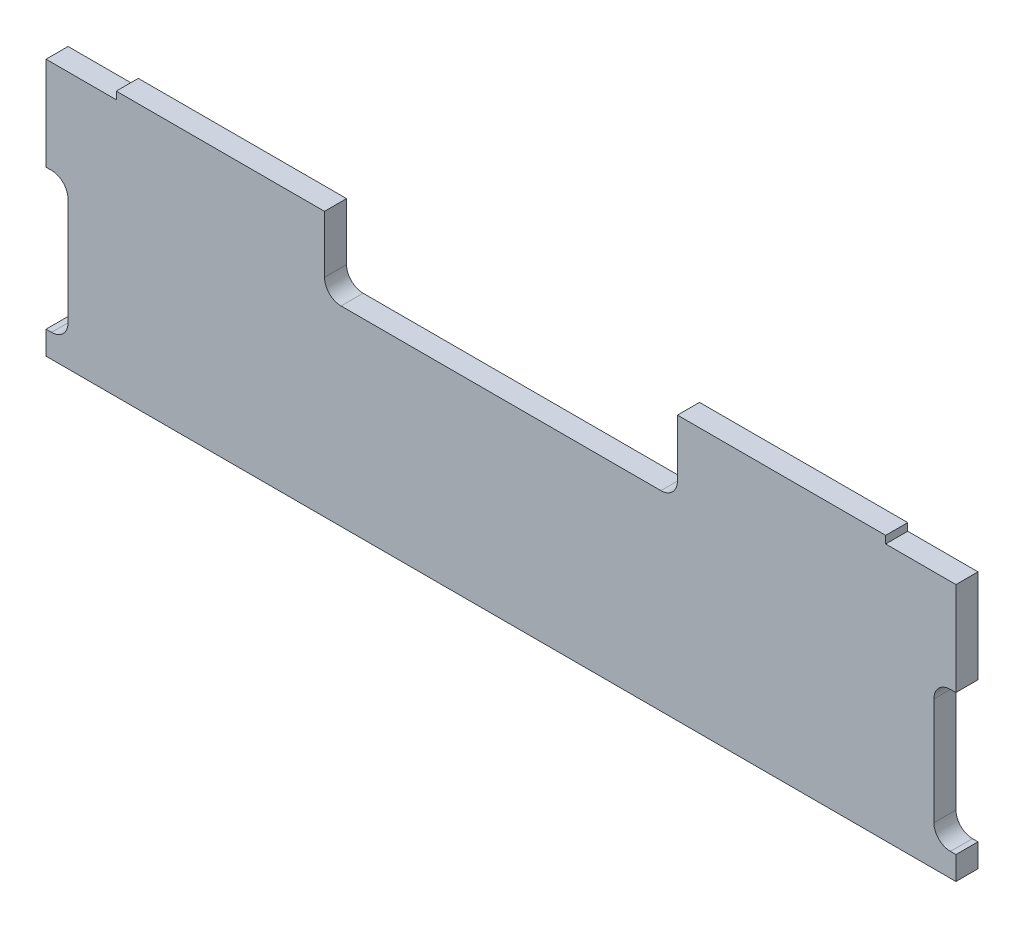
ISO-10303-21;
HEADER;
FILE_DESCRIPTION(('STEP AP214'),'2;1');
FILE_NAME('part.step','',(''),(''),'','','');
FILE_SCHEMA(('AUTOMOTIVE_DESIGN { 1 0 10303 214 1 1 1 1 }'));
ENDSEC;
DATA;
#1=APPLICATION_CONTEXT('core data for automotive mechanical design processes');
#2=APPLICATION_PROTOCOL_DEFINITION('international standard','automotive_design',2000,#1);
#3=PRODUCT_CONTEXT('',#1,'mechanical');
#4=PRODUCT('Part','Part','',(#3));
#5=PRODUCT_RELATED_PRODUCT_CATEGORY('part','',(#4));
#6=PRODUCT_DEFINITION_FORMATION('','',#4);
#7=PRODUCT_DEFINITION_CONTEXT('part definition',#1,'design');
#8=PRODUCT_DEFINITION('design','',#6,#7);
#9=PRODUCT_DEFINITION_SHAPE('','',#8);
#10=(LENGTH_UNIT() NAMED_UNIT(*) SI_UNIT(.MILLI.,.METRE.));
#11=(NAMED_UNIT(*) PLANE_ANGLE_UNIT() SI_UNIT($,.RADIAN.));
#12=(NAMED_UNIT(*) SI_UNIT($,.STERADIAN.) SOLID_ANGLE_UNIT());
#13=UNCERTAINTY_MEASURE_WITH_UNIT(LENGTH_MEASURE(1.E-05),#10,'distance_accuracy_value','');
#14=(GEOMETRIC_REPRESENTATION_CONTEXT(3) GLOBAL_UNCERTAINTY_ASSIGNED_CONTEXT((#13)) GLOBAL_UNIT_ASSIGNED_CONTEXT((#10,
#11,#12)) REPRESENTATION_CONTEXT('',''));
#15=CARTESIAN_POINT('',(0.,0.,0.));
#16=DIRECTION('',(0.,0.,1.));
#17=DIRECTION('',(1.,0.,0.));
#18=AXIS2_PLACEMENT_3D('',#15,#16,#17);
#19=CARTESIAN_POINT('',(130.96875,37.0049753820034,6.35));
#20=DIRECTION('',(0.,-1.,0.));
#21=DIRECTION('',(1.,0.,0.));
#22=AXIS2_PLACEMENT_3D('',#19,#20,#21);
#23=PLANE('',#22);
#24=DIRECTION('',(-1.,0.,0.));
#25=VECTOR('',#24,1.);
#26=CARTESIAN_POINT('',(130.96875,37.0049753820034,6.35));
#27=LINE('',#26,#25);
#28=CARTESIAN_POINT('',(-110.744,37.0049753820034,6.35));
#29=VERTEX_POINT('',#28);
#30=CARTESIAN_POINT('',(-130.96875,37.0049753820034,6.35));
#31=VERTEX_POINT('',#30);
#32=EDGE_CURVE('E282',#29,#31,#27,.T.);
#33=ORIENTED_EDGE('',*,*,#32,.F.);
#34=DIRECTION('',(0.,0.,1.));
#35=VECTOR('',#34,1.);
#36=CARTESIAN_POINT('',(-110.744,37.0049753820034,-59.9828676957012));
#37=LINE('',#36,#35);
#38=CARTESIAN_POINT('',(-110.744,37.0049753820034,0.));
#39=VERTEX_POINT('',#38);
#40=EDGE_CURVE('E245',#39,#29,#37,.T.);
#41=ORIENTED_EDGE('',*,*,#40,.F.);
#42=DIRECTION('',(-1.,0.,0.));
#43=VECTOR('',#42,1.);
#44=CARTESIAN_POINT('',(130.96875,37.0049753820034,0.));
#45=LINE('',#44,#43);
#46=CARTESIAN_POINT('',(-130.96875,37.0049753820034,0.));
#47=VERTEX_POINT('',#46);
#48=EDGE_CURVE('E272',#39,#47,#45,.T.);
#49=ORIENTED_EDGE('',*,*,#48,.T.);
#50=DIRECTION('',(0.,0.,-1.));
#51=VECTOR('',#50,1.);
#52=CARTESIAN_POINT('',(-130.96875,37.0049753820034,6.35));
#53=LINE('',#52,#51);
#54=EDGE_CURVE('E317',#31,#47,#53,.T.);
#55=ORIENTED_EDGE('',*,*,#54,.F.);
#56=EDGE_LOOP('',(#33,#41,#49,#55));
#57=FACE_BOUND('',#56,.T.);
#58=ADVANCED_FACE('F34',(#57),#23,.F.);
#59=CARTESIAN_POINT('',(130.96875,37.0049753820034,6.35));
#60=DIRECTION('',(-1.,0.,0.));
#61=DIRECTION('',(0.,0.,1.));
#62=AXIS2_PLACEMENT_3D('',#59,#60,#61);
#63=PLANE('',#62);
#64=DIRECTION('',(0.,1.,0.));
#65=VECTOR('',#64,1.);
#66=CARTESIAN_POINT('',(130.96875,37.0049753820034,0.));
#67=LINE('',#66,#65);
#68=CARTESIAN_POINT('',(130.96875,-37.0360246179966,0.));
#69=VERTEX_POINT('',#68);
#70=CARTESIAN_POINT('',(130.96875,-30.3050246179966,0.));
#71=VERTEX_POINT('',#70);
#72=EDGE_CURVE('E269',#69,#71,#67,.T.);
#73=ORIENTED_EDGE('',*,*,#72,.T.);
#74=DIRECTION('',(0.,0.,1.));
#75=VECTOR('',#74,1.);
#76=CARTESIAN_POINT('',(130.96875,-30.3050246179966,0.));
#77=LINE('',#76,#75);
#78=CARTESIAN_POINT('',(130.96875,-30.3050246179966,6.35));
#79=VERTEX_POINT('',#78);
#80=EDGE_CURVE('E274',#71,#79,#77,.T.);
#81=ORIENTED_EDGE('',*,*,#80,.T.);
#82=DIRECTION('',(0.,1.,0.));
#83=VECTOR('',#82,1.);
#84=CARTESIAN_POINT('',(130.96875,37.0049753820034,6.35));
#85=LINE('',#84,#83);
#86=CARTESIAN_POINT('',(130.96875,-37.0360246179966,6.35));
#87=VERTEX_POINT('',#86);
#88=EDGE_CURVE('E279',#87,#79,#85,.T.);
#89=ORIENTED_EDGE('',*,*,#88,.F.);
#90=DIRECTION('',(0.,0.,-1.));
#91=VECTOR('',#90,1.);
#92=CARTESIAN_POINT('',(130.96875,-37.0360246179966,6.35));
#93=LINE('',#92,#91);
#94=EDGE_CURVE('E284',#87,#69,#93,.T.);
#95=ORIENTED_EDGE('',*,*,#94,.T.);
#96=EDGE_LOOP('',(#73,#81,#89,#95));
#97=FACE_BOUND('',#96,.T.);
#98=ADVANCED_FACE('F455',(#97),#63,.F.);
#99=CARTESIAN_POINT('',(-130.96875,37.0049753820034,6.35));
#100=DIRECTION('',(1.,0.,0.));
#101=DIRECTION('',(0.,0.,-1.));
#102=AXIS2_PLACEMENT_3D('',#99,#100,#101);
#103=PLANE('',#102);
#104=DIRECTION('',(0.,-1.,0.));
#105=VECTOR('',#104,1.);
#106=CARTESIAN_POINT('',(-130.96875,37.0049753820034,0.));
#107=LINE('',#106,#105);
#108=CARTESIAN_POINT('',(-130.96875,10.0809753820034,0.));
#109=VERTEX_POINT('',#108);
#110=EDGE_CURVE('E291',#47,#109,#107,.T.);
#111=ORIENTED_EDGE('',*,*,#110,.T.);
#112=DIRECTION('',(0.,0.,1.));
#113=VECTOR('',#112,1.);
#114=CARTESIAN_POINT('',(-130.96875,10.0809753820034,0.));
#115=LINE('',#114,#113);
#116=CARTESIAN_POINT('',(-130.96875,10.0809753820034,6.35));
#117=VERTEX_POINT('',#116);
#118=EDGE_CURVE('E302',#109,#117,#115,.T.);
#119=ORIENTED_EDGE('',*,*,#118,.T.);
#120=DIRECTION('',(0.,-1.,0.));
#121=VECTOR('',#120,1.);
#122=CARTESIAN_POINT('',(-130.96875,37.0049753820034,6.35));
#123=LINE('',#122,#121);
#124=EDGE_CURVE('E294',#31,#117,#123,.T.);
#125=ORIENTED_EDGE('',*,*,#124,.F.);
#126=ORIENTED_EDGE('',*,*,#54,.T.);
#127=EDGE_LOOP('',(#111,#119,#125,#126));
#128=FACE_BOUND('',#127,.T.);
#129=ADVANCED_FACE('F492',(#128),#103,.F.);
#130=DIRECTION('',(0.,-1.,0.));
#131=VECTOR('',#130,1.);
#132=CARTESIAN_POINT('',(-130.96875,37.0049753820034,6.35));
#133=LINE('',#132,#131);
#134=CARTESIAN_POINT('',(-130.96875,-30.3050246179966,6.35));
#135=VERTEX_POINT('',#134);
#136=CARTESIAN_POINT('',(-130.96875,-37.0360246179966,6.35));
#137=VERTEX_POINT('',#136);
#138=EDGE_CURVE('E298',#135,#137,#133,.T.);
#139=ORIENTED_EDGE('',*,*,#138,.F.);
#140=DIRECTION('',(0.,0.,1.));
#141=VECTOR('',#140,1.);
#142=CARTESIAN_POINT('',(-130.96875,-30.3050246179966,0.));
#143=LINE('',#142,#141);
#144=CARTESIAN_POINT('',(-130.96875,-30.3050246179966,0.));
#145=VERTEX_POINT('',#144);
#146=EDGE_CURVE('E300',#145,#135,#143,.T.);
#147=ORIENTED_EDGE('',*,*,#146,.F.);
#148=DIRECTION('',(0.,-1.,0.));
#149=VECTOR('',#148,1.);
#150=CARTESIAN_POINT('',(-130.96875,37.0049753820034,0.));
#151=LINE('',#150,#149);
#152=CARTESIAN_POINT('',(-130.96875,-37.0360246179966,0.));
#153=VERTEX_POINT('',#152);
#154=EDGE_CURVE('E304',#145,#153,#151,.T.);
#155=ORIENTED_EDGE('',*,*,#154,.T.);
#156=DIRECTION('',(0.,0.,-1.));
#157=VECTOR('',#156,1.);
#158=CARTESIAN_POINT('',(-130.96875,-37.0360246179966,6.35));
#159=LINE('',#158,#157);
#160=EDGE_CURVE('E287',#137,#153,#159,.T.);
#161=ORIENTED_EDGE('',*,*,#160,.F.);
#162=EDGE_LOOP('',(#139,#147,#155,#161));
#163=FACE_BOUND('',#162,.T.);
#164=ADVANCED_FACE('F464',(#163),#103,.F.);
#165=CARTESIAN_POINT('',(130.96875,-37.0360246179966,6.35));
#166=DIRECTION('',(0.,1.,0.));
#167=DIRECTION('',(-1.,0.,0.));
#168=AXIS2_PLACEMENT_3D('',#165,#166,#167);
#169=PLANE('',#168);
#170=DIRECTION('',(1.,0.,0.));
#171=VECTOR('',#170,1.);
#172=CARTESIAN_POINT('',(130.96875,-37.0360246179966,0.));
#173=LINE('',#172,#171);
#174=EDGE_CURVE('E289',#153,#69,#173,.T.);
#175=ORIENTED_EDGE('',*,*,#174,.T.);
#176=ORIENTED_EDGE('',*,*,#94,.F.);
#177=DIRECTION('',(1.,0.,0.));
#178=VECTOR('',#177,1.);
#179=CARTESIAN_POINT('',(130.96875,-37.0360246179966,6.35));
#180=LINE('',#179,#178);
#181=EDGE_CURVE('E292',#137,#87,#180,.T.);
#182=ORIENTED_EDGE('',*,*,#181,.F.);
#183=ORIENTED_EDGE('',*,*,#160,.T.);
#184=EDGE_LOOP('',(#175,#176,#182,#183));
#185=FACE_BOUND('',#184,.T.);
#186=ADVANCED_FACE('F461',(#185),#169,.F.);
#187=DIRECTION('',(0.,1.,0.));
#188=VECTOR('',#187,1.);
#189=CARTESIAN_POINT('',(130.96875,37.0049753820034,6.35));
#190=LINE('',#189,#188);
#191=CARTESIAN_POINT('',(130.96875,10.0809753820034,6.35));
#192=VERTEX_POINT('',#191);
#193=CARTESIAN_POINT('',(130.96875,37.0049753820034,6.35));
#194=VERTEX_POINT('',#193);
#195=EDGE_CURVE('E283',#192,#194,#190,.T.);
#196=ORIENTED_EDGE('',*,*,#195,.F.);
#197=DIRECTION('',(0.,0.,1.));
#198=VECTOR('',#197,1.);
#199=CARTESIAN_POINT('',(130.96875,10.0809753820034,0.));
#200=LINE('',#199,#198);
#201=CARTESIAN_POINT('',(130.96875,10.0809753820034,0.));
#202=VERTEX_POINT('',#201);
#203=EDGE_CURVE('E278',#202,#192,#200,.T.);
#204=ORIENTED_EDGE('',*,*,#203,.F.);
#205=DIRECTION('',(0.,1.,0.));
#206=VECTOR('',#205,1.);
#207=CARTESIAN_POINT('',(130.96875,37.0049753820034,0.));
#208=LINE('',#207,#206);
#209=CARTESIAN_POINT('',(130.96875,37.0049753820034,0.));
#210=VERTEX_POINT('',#209);
#211=EDGE_CURVE('E273',#202,#210,#208,.T.);
#212=ORIENTED_EDGE('',*,*,#211,.T.);
#213=DIRECTION('',(0.,0.,-1.));
#214=VECTOR('',#213,1.);
#215=CARTESIAN_POINT('',(130.96875,37.0049753820034,6.35));
#216=LINE('',#215,#214);
#217=EDGE_CURVE('E288',#194,#210,#216,.T.);
#218=ORIENTED_EDGE('',*,*,#217,.F.);
#219=EDGE_LOOP('',(#196,#204,#212,#218));
#220=FACE_BOUND('',#219,.T.);
#221=ADVANCED_FACE('F430',(#220),#63,.F.);
#222=CARTESIAN_POINT('',(110.744,37.0049753820034,0.));
#223=VERTEX_POINT('',#222);
#224=EDGE_CURVE('E54',#210,#223,#45,.T.);
#225=ORIENTED_EDGE('',*,*,#224,.T.);
#226=DIRECTION('',(0.,0.,1.));
#227=VECTOR('',#226,1.);
#228=CARTESIAN_POINT('',(110.744,37.0049753820034,-59.9828676957012));
#229=LINE('',#228,#227);
#230=CARTESIAN_POINT('',(110.744,37.0049753820034,6.35));
#231=VERTEX_POINT('',#230);
#232=EDGE_CURVE('E49',#223,#231,#229,.T.);
#233=ORIENTED_EDGE('',*,*,#232,.T.);
#234=EDGE_CURVE('E315',#194,#231,#27,.T.);
#235=ORIENTED_EDGE('',*,*,#234,.F.);
#236=ORIENTED_EDGE('',*,*,#217,.T.);
#237=EDGE_LOOP('',(#225,#233,#235,#236));
#238=FACE_BOUND('',#237,.T.);
#239=ADVANCED_FACE('F425',(#238),#23,.F.);
#240=CARTESIAN_POINT('',(0.,-0.0155246179966039,6.35));
#241=DIRECTION('',(0.,0.,-1.));
#242=DIRECTION('',(-1.,0.,0.));
#243=AXIS2_PLACEMENT_3D('',#240,#241,#242);
#244=PLANE('',#243);
#245=DIRECTION('',(1.,0.,0.));
#246=VECTOR('',#245,1.);
#247=CARTESIAN_POINT('',(-50.8,17.9549753820034,6.35));
#248=LINE('',#247,#246);
#249=CARTESIAN_POINT('',(-46.0375,17.9549753820034,6.35));
#250=VERTEX_POINT('',#249);
#251=CARTESIAN_POINT('',(46.0375,17.9549753820034,6.35));
#252=VERTEX_POINT('',#251);
#253=EDGE_CURVE('E265',#250,#252,#248,.T.);
#254=ORIENTED_EDGE('',*,*,#253,.F.);
#255=CARTESIAN_POINT('',(-46.0375,22.7174753820034,6.35));
#256=DIRECTION('',(0.,0.,-1.));
#257=DIRECTION('',(-1.,0.,0.));
#258=AXIS2_PLACEMENT_3D('',#255,#256,#257);
#259=CIRCLE('',#258,4.7625);
#260=CARTESIAN_POINT('',(-50.8,22.7174753820034,6.35));
#261=VERTEX_POINT('',#260);
#262=EDGE_CURVE('E42',#250,#261,#259,.T.);
#263=ORIENTED_EDGE('',*,*,#262,.T.);
#264=DIRECTION('',(0.,-1.,0.));
#265=VECTOR('',#264,1.);
#266=CARTESIAN_POINT('',(-50.8,37.0049753820034,6.35));
#267=LINE('',#266,#265);
#268=CARTESIAN_POINT('',(-50.8,39.1639753820034,6.35));
#269=VERTEX_POINT('',#268);
#270=EDGE_CURVE('E254',#269,#261,#267,.T.);
#271=ORIENTED_EDGE('',*,*,#270,.F.);
#272=DIRECTION('',(-1.,0.,0.));
#273=VECTOR('',#272,1.);
#274=CARTESIAN_POINT('',(-110.744,39.1639753820034,6.35));
#275=LINE('',#274,#273);
#276=CARTESIAN_POINT('',(-110.744,39.1639753820034,6.35));
#277=VERTEX_POINT('',#276);
#278=EDGE_CURVE('E237',#269,#277,#275,.T.);
#279=ORIENTED_EDGE('',*,*,#278,.T.);
#280=DIRECTION('',(0.,-1.,0.));
#281=VECTOR('',#280,1.);
#282=CARTESIAN_POINT('',(-110.744,37.0049753820034,6.35));
#283=LINE('',#282,#281);
#284=EDGE_CURVE('E236',#277,#29,#283,.T.);
#285=ORIENTED_EDGE('',*,*,#284,.T.);
#286=ORIENTED_EDGE('',*,*,#32,.T.);
#287=ORIENTED_EDGE('',*,*,#124,.T.);
#288=DIRECTION('',(-1.,0.,0.));
#289=VECTOR('',#288,1.);
#290=CARTESIAN_POINT('',(-130.96875,10.0809753820034,6.35));
#291=LINE('',#290,#289);
#292=CARTESIAN_POINT('',(-129.38125,10.0809753820034,6.35));
#293=VERTEX_POINT('',#292);
#294=EDGE_CURVE('E320',#293,#117,#291,.T.);
#295=ORIENTED_EDGE('',*,*,#294,.F.);
#296=CARTESIAN_POINT('',(-129.38125,5.31847538200337,6.35));
#297=DIRECTION('',(0.,0.,-1.));
#298=DIRECTION('',(-1.,0.,0.));
#299=AXIS2_PLACEMENT_3D('',#296,#297,#298);
#300=CIRCLE('',#299,4.7625);
#301=CARTESIAN_POINT('',(-124.61875,5.31847538200337,6.35));
#302=VERTEX_POINT('',#301);
#303=EDGE_CURVE('E392',#293,#302,#300,.T.);
#304=ORIENTED_EDGE('',*,*,#303,.T.);
#305=DIRECTION('',(0.,1.,0.));
#306=VECTOR('',#305,1.);
#307=CARTESIAN_POINT('',(-124.61875,10.0809753820034,6.35));
#308=LINE('',#307,#306);
#309=CARTESIAN_POINT('',(-124.61875,-25.5425246179966,6.35));
#310=VERTEX_POINT('',#309);
#311=EDGE_CURVE('E323',#310,#302,#308,.T.);
#312=ORIENTED_EDGE('',*,*,#311,.F.);
#313=CARTESIAN_POINT('',(-129.38125,-25.5425246179966,6.35));
#314=DIRECTION('',(0.,0.,-1.));
#315=DIRECTION('',(-1.,0.,0.));
#316=AXIS2_PLACEMENT_3D('',#313,#314,#315);
#317=CIRCLE('',#316,4.7625);
#318=CARTESIAN_POINT('',(-129.38125,-30.3050246179966,6.35));
#319=VERTEX_POINT('',#318);
#320=EDGE_CURVE('E388',#310,#319,#317,.T.);
#321=ORIENTED_EDGE('',*,*,#320,.T.);
#322=DIRECTION('',(1.,0.,0.));
#323=VECTOR('',#322,1.);
#324=CARTESIAN_POINT('',(-130.96875,-30.3050246179966,6.35));
#325=LINE('',#324,#323);
#326=EDGE_CURVE('E277',#135,#319,#325,.T.);
#327=ORIENTED_EDGE('',*,*,#326,.F.);
#328=ORIENTED_EDGE('',*,*,#138,.T.);
#329=ORIENTED_EDGE('',*,*,#181,.T.);
#330=ORIENTED_EDGE('',*,*,#88,.T.);
#331=DIRECTION('',(1.,0.,0.));
#332=VECTOR('',#331,1.);
#333=CARTESIAN_POINT('',(130.96875,-30.3050246179966,6.35));
#334=LINE('',#333,#332);
#335=CARTESIAN_POINT('',(129.38125,-30.3050246179966,6.35));
#336=VERTEX_POINT('',#335);
#337=EDGE_CURVE('E306',#336,#79,#334,.T.);
#338=ORIENTED_EDGE('',*,*,#337,.F.);
#339=CARTESIAN_POINT('',(129.38125,-25.5425246179966,6.35));
#340=DIRECTION('',(0.,0.,-1.));
#341=DIRECTION('',(-1.,0.,0.));
#342=AXIS2_PLACEMENT_3D('',#339,#340,#341);
#343=CIRCLE('',#342,4.7625);
#344=CARTESIAN_POINT('',(124.61875,-25.5425246179966,6.35));
#345=VERTEX_POINT('',#344);
#346=EDGE_CURVE('E380',#336,#345,#343,.T.);
#347=ORIENTED_EDGE('',*,*,#346,.T.);
#348=DIRECTION('',(0.,-1.,0.));
#349=VECTOR('',#348,1.);
#350=CARTESIAN_POINT('',(124.61875,10.0809753820034,6.35));
#351=LINE('',#350,#349);
#352=CARTESIAN_POINT('',(124.61875,5.3184753820034,6.35));
#353=VERTEX_POINT('',#352);
#354=EDGE_CURVE('E309',#353,#345,#351,.T.);
#355=ORIENTED_EDGE('',*,*,#354,.F.);
#356=CARTESIAN_POINT('',(129.38125,5.3184753820034,6.35));
#357=DIRECTION('',(0.,0.,-1.));
#358=DIRECTION('',(-1.,0.,0.));
#359=AXIS2_PLACEMENT_3D('',#356,#357,#358);
#360=CIRCLE('',#359,4.7625);
#361=CARTESIAN_POINT('',(129.38125,10.0809753820034,6.35));
#362=VERTEX_POINT('',#361);
#363=EDGE_CURVE('E384',#353,#362,#360,.T.);
#364=ORIENTED_EDGE('',*,*,#363,.T.);
#365=DIRECTION('',(-1.,0.,0.));
#366=VECTOR('',#365,1.);
#367=CARTESIAN_POINT('',(130.96875,10.0809753820034,6.35));
#368=LINE('',#367,#366);
#369=EDGE_CURVE('E262',#192,#362,#368,.T.);
#370=ORIENTED_EDGE('',*,*,#369,.F.);
#371=ORIENTED_EDGE('',*,*,#195,.T.);
#372=ORIENTED_EDGE('',*,*,#234,.T.);
#373=DIRECTION('',(0.,1.,0.));
#374=VECTOR('',#373,1.);
#375=CARTESIAN_POINT('',(110.744,37.0049753820034,6.35));
#376=LINE('',#375,#374);
#377=CARTESIAN_POINT('',(110.744,39.1639753820034,6.35));
#378=VERTEX_POINT('',#377);
#379=EDGE_CURVE('E230',#231,#378,#376,.T.);
#380=ORIENTED_EDGE('',*,*,#379,.T.);
#381=DIRECTION('',(-1.,0.,0.));
#382=VECTOR('',#381,1.);
#383=CARTESIAN_POINT('',(110.744,39.1639753820034,6.35));
#384=LINE('',#383,#382);
#385=CARTESIAN_POINT('',(50.8,39.1639753820034,6.35));
#386=VERTEX_POINT('',#385);
#387=EDGE_CURVE('E223',#378,#386,#384,.T.);
#388=ORIENTED_EDGE('',*,*,#387,.T.);
#389=DIRECTION('',(0.,1.,0.));
#390=VECTOR('',#389,1.);
#391=CARTESIAN_POINT('',(50.8,37.0049753820034,6.35));
#392=LINE('',#391,#390);
#393=CARTESIAN_POINT('',(50.8,22.7174753820034,6.35));
#394=VERTEX_POINT('',#393);
#395=EDGE_CURVE('E258',#394,#386,#392,.T.);
#396=ORIENTED_EDGE('',*,*,#395,.F.);
#397=CARTESIAN_POINT('',(46.0375,22.7174753820034,6.35));
#398=DIRECTION('',(0.,0.,-1.));
#399=DIRECTION('',(-1.,0.,0.));
#400=AXIS2_PLACEMENT_3D('',#397,#398,#399);
#401=CIRCLE('',#400,4.7625);
#402=EDGE_CURVE('E396',#394,#252,#401,.T.);
#403=ORIENTED_EDGE('',*,*,#402,.T.);
#404=EDGE_LOOP('',(#254,#263,#271,#279,#285,#286,#287,#295,#304,#312,#321,#327,#328,#329,#330,
#338,#347,#355,#364,#370,#371,#372,#380,#388,#396,#403));
#405=FACE_BOUND('',#404,.T.);
#406=ADVANCED_FACE('F401',(#405),#244,.F.);
#407=CARTESIAN_POINT('',(0.,-0.0155246179966039,0.));
#408=DIRECTION('',(0.,0.,-1.));
#409=DIRECTION('',(-1.,0.,0.));
#410=AXIS2_PLACEMENT_3D('',#407,#408,#409);
#411=PLANE('',#410);
#412=DIRECTION('',(0.,-1.,0.));
#413=VECTOR('',#412,1.);
#414=CARTESIAN_POINT('',(-50.8,37.0049753820034,0.));
#415=LINE('',#414,#413);
#416=CARTESIAN_POINT('',(-50.8,39.1639753820034,0.));
#417=VERTEX_POINT('',#416);
#418=CARTESIAN_POINT('',(-50.8,22.7174753820034,0.));
#419=VERTEX_POINT('',#418);
#420=EDGE_CURVE('E255',#417,#419,#415,.T.);
#421=ORIENTED_EDGE('',*,*,#420,.T.);
#422=CARTESIAN_POINT('',(-46.0375,22.7174753820034,0.));
#423=DIRECTION('',(0.,0.,-1.));
#424=DIRECTION('',(-1.,0.,0.));
#425=AXIS2_PLACEMENT_3D('',#422,#423,#424);
#426=CIRCLE('',#425,4.7625);
#427=CARTESIAN_POINT('',(-46.0375,17.9549753820034,0.));
#428=VERTEX_POINT('',#427);
#429=EDGE_CURVE('E11',#419,#428,#426,.F.);
#430=ORIENTED_EDGE('',*,*,#429,.T.);
#431=DIRECTION('',(1.,0.,0.));
#432=VECTOR('',#431,1.);
#433=CARTESIAN_POINT('',(-50.8,17.9549753820034,0.));
#434=LINE('',#433,#432);
#435=CARTESIAN_POINT('',(46.0375,17.9549753820034,0.));
#436=VERTEX_POINT('',#435);
#437=EDGE_CURVE('E257',#428,#436,#434,.T.);
#438=ORIENTED_EDGE('',*,*,#437,.T.);
#439=CARTESIAN_POINT('',(46.0375,22.7174753820034,0.));
#440=DIRECTION('',(0.,0.,-1.));
#441=DIRECTION('',(-1.,0.,0.));
#442=AXIS2_PLACEMENT_3D('',#439,#440,#441);
#443=CIRCLE('',#442,4.7625);
#444=CARTESIAN_POINT('',(50.8,22.7174753820034,0.));
#445=VERTEX_POINT('',#444);
#446=EDGE_CURVE('E398',#436,#445,#443,.F.);
#447=ORIENTED_EDGE('',*,*,#446,.T.);
#448=DIRECTION('',(0.,1.,0.));
#449=VECTOR('',#448,1.);
#450=CARTESIAN_POINT('',(50.8,37.0049753820034,0.));
#451=LINE('',#450,#449);
#452=CARTESIAN_POINT('',(50.8,39.1639753820034,0.));
#453=VERTEX_POINT('',#452);
#454=EDGE_CURVE('E213',#445,#453,#451,.T.);
#455=ORIENTED_EDGE('',*,*,#454,.T.);
#456=DIRECTION('',(-1.,0.,0.));
#457=VECTOR('',#456,1.);
#458=CARTESIAN_POINT('',(110.744,39.1639753820034,0.));
#459=LINE('',#458,#457);
#460=CARTESIAN_POINT('',(110.744,39.1639753820034,0.));
#461=VERTEX_POINT('',#460);
#462=EDGE_CURVE('E206',#461,#453,#459,.T.);
#463=ORIENTED_EDGE('',*,*,#462,.F.);
#464=DIRECTION('',(0.,1.,0.));
#465=VECTOR('',#464,1.);
#466=CARTESIAN_POINT('',(110.744,37.0049753820034,0.));
#467=LINE('',#466,#465);
#468=EDGE_CURVE('E211',#223,#461,#467,.T.);
#469=ORIENTED_EDGE('',*,*,#468,.F.);
#470=ORIENTED_EDGE('',*,*,#224,.F.);
#471=ORIENTED_EDGE('',*,*,#211,.F.);
#472=DIRECTION('',(-1.,0.,0.));
#473=VECTOR('',#472,1.);
#474=CARTESIAN_POINT('',(130.96875,10.0809753820034,0.));
#475=LINE('',#474,#473);
#476=CARTESIAN_POINT('',(129.38125,10.0809753820034,0.));
#477=VERTEX_POINT('',#476);
#478=EDGE_CURVE('E308',#202,#477,#475,.T.);
#479=ORIENTED_EDGE('',*,*,#478,.T.);
#480=CARTESIAN_POINT('',(129.38125,5.3184753820034,0.));
#481=DIRECTION('',(0.,0.,-1.));
#482=DIRECTION('',(-1.,0.,0.));
#483=AXIS2_PLACEMENT_3D('',#480,#481,#482);
#484=CIRCLE('',#483,4.7625);
#485=CARTESIAN_POINT('',(124.61875,5.3184753820034,0.));
#486=VERTEX_POINT('',#485);
#487=EDGE_CURVE('E386',#477,#486,#484,.F.);
#488=ORIENTED_EDGE('',*,*,#487,.T.);
#489=DIRECTION('',(0.,-1.,0.));
#490=VECTOR('',#489,1.);
#491=CARTESIAN_POINT('',(124.61875,10.0809753820034,0.));
#492=LINE('',#491,#490);
#493=CARTESIAN_POINT('',(124.61875,-25.5425246179966,0.));
#494=VERTEX_POINT('',#493);
#495=EDGE_CURVE('E340',#486,#494,#492,.T.);
#496=ORIENTED_EDGE('',*,*,#495,.T.);
#497=CARTESIAN_POINT('',(129.38125,-25.5425246179966,0.));
#498=DIRECTION('',(0.,0.,-1.));
#499=DIRECTION('',(-1.,0.,0.));
#500=AXIS2_PLACEMENT_3D('',#497,#498,#499);
#501=CIRCLE('',#500,4.7625);
#502=CARTESIAN_POINT('',(129.38125,-30.3050246179966,0.));
#503=VERTEX_POINT('',#502);
#504=EDGE_CURVE('E382',#494,#503,#501,.F.);
#505=ORIENTED_EDGE('',*,*,#504,.T.);
#506=DIRECTION('',(1.,0.,0.));
#507=VECTOR('',#506,1.);
#508=CARTESIAN_POINT('',(130.96875,-30.3050246179966,0.));
#509=LINE('',#508,#507);
#510=EDGE_CURVE('E337',#503,#71,#509,.T.);
#511=ORIENTED_EDGE('',*,*,#510,.T.);
#512=ORIENTED_EDGE('',*,*,#72,.F.);
#513=ORIENTED_EDGE('',*,*,#174,.F.);
#514=ORIENTED_EDGE('',*,*,#154,.F.);
#515=DIRECTION('',(1.,0.,0.));
#516=VECTOR('',#515,1.);
#517=CARTESIAN_POINT('',(-130.96875,-30.3050246179966,0.));
#518=LINE('',#517,#516);
#519=CARTESIAN_POINT('',(-129.38125,-30.3050246179966,0.));
#520=VERTEX_POINT('',#519);
#521=EDGE_CURVE('E322',#145,#520,#518,.T.);
#522=ORIENTED_EDGE('',*,*,#521,.T.);
#523=CARTESIAN_POINT('',(-129.38125,-25.5425246179966,0.));
#524=DIRECTION('',(0.,0.,-1.));
#525=DIRECTION('',(-1.,0.,0.));
#526=AXIS2_PLACEMENT_3D('',#523,#524,#525);
#527=CIRCLE('',#526,4.7625);
#528=CARTESIAN_POINT('',(-124.61875,-25.5425246179966,0.));
#529=VERTEX_POINT('',#528);
#530=EDGE_CURVE('E390',#520,#529,#527,.F.);
#531=ORIENTED_EDGE('',*,*,#530,.T.);
#532=DIRECTION('',(0.,1.,0.));
#533=VECTOR('',#532,1.);
#534=CARTESIAN_POINT('',(-124.61875,10.0809753820034,0.));
#535=LINE('',#534,#533);
#536=CARTESIAN_POINT('',(-124.61875,5.31847538200337,0.));
#537=VERTEX_POINT('',#536);
#538=EDGE_CURVE('E343',#529,#537,#535,.T.);
#539=ORIENTED_EDGE('',*,*,#538,.T.);
#540=CARTESIAN_POINT('',(-129.38125,5.31847538200337,0.));
#541=DIRECTION('',(0.,0.,-1.));
#542=DIRECTION('',(-1.,0.,0.));
#543=AXIS2_PLACEMENT_3D('',#540,#541,#542);
#544=CIRCLE('',#543,4.7625);
#545=CARTESIAN_POINT('',(-129.38125,10.0809753820034,0.));
#546=VERTEX_POINT('',#545);
#547=EDGE_CURVE('E394',#537,#546,#544,.F.);
#548=ORIENTED_EDGE('',*,*,#547,.T.);
#549=DIRECTION('',(-1.,0.,0.));
#550=VECTOR('',#549,1.);
#551=CARTESIAN_POINT('',(-130.96875,10.0809753820034,0.));
#552=LINE('',#551,#550);
#553=EDGE_CURVE('E303',#546,#109,#552,.T.);
#554=ORIENTED_EDGE('',*,*,#553,.T.);
#555=ORIENTED_EDGE('',*,*,#110,.F.);
#556=ORIENTED_EDGE('',*,*,#48,.F.);
#557=DIRECTION('',(0.,-1.,0.));
#558=VECTOR('',#557,1.);
#559=CARTESIAN_POINT('',(-110.744,37.0049753820034,0.));
#560=LINE('',#559,#558);
#561=CARTESIAN_POINT('',(-110.744,39.1639753820034,0.));
#562=VERTEX_POINT('',#561);
#563=EDGE_CURVE('E243',#562,#39,#560,.T.);
#564=ORIENTED_EDGE('',*,*,#563,.F.);
#565=DIRECTION('',(-1.,0.,0.));
#566=VECTOR('',#565,1.);
#567=CARTESIAN_POINT('',(-110.744,39.1639753820034,0.));
#568=LINE('',#567,#566);
#569=EDGE_CURVE('E247',#417,#562,#568,.T.);
#570=ORIENTED_EDGE('',*,*,#569,.F.);
#571=EDGE_LOOP('',(#421,#430,#438,#447,#455,#463,#469,#470,#471,#479,#488,#496,#505,#511,#512,
#513,#514,#522,#531,#539,#548,#554,#555,#556,#564,#570));
#572=FACE_BOUND('',#571,.T.);
#573=ADVANCED_FACE('F209',(#572),#411,.T.);
#574=CARTESIAN_POINT('',(-130.96875,10.0809753820034,0.));
#575=DIRECTION('',(0.,1.,0.));
#576=DIRECTION('',(-1.,0.,0.));
#577=AXIS2_PLACEMENT_3D('',#574,#575,#576);
#578=PLANE('',#577);
#579=ORIENTED_EDGE('',*,*,#553,.F.);
#580=DIRECTION('',(0.,0.,1.));
#581=VECTOR('',#580,1.);
#582=CARTESIAN_POINT('',(-129.38125,10.0809753820034,6.35));
#583=LINE('',#582,#581);
#584=EDGE_CURVE('E367',#546,#293,#583,.T.);
#585=ORIENTED_EDGE('',*,*,#584,.T.);
#586=ORIENTED_EDGE('',*,*,#294,.T.);
#587=ORIENTED_EDGE('',*,*,#118,.F.);
#588=EDGE_LOOP('',(#579,#585,#586,#587));
#589=FACE_BOUND('',#588,.T.);
#590=ADVANCED_FACE('F486',(#589),#578,.F.);
#591=CARTESIAN_POINT('',(-124.61875,10.0809753820034,0.));
#592=DIRECTION('',(1.,0.,0.));
#593=DIRECTION('',(0.,0.,-1.));
#594=AXIS2_PLACEMENT_3D('',#591,#592,#593);
#595=PLANE('',#594);
#596=ORIENTED_EDGE('',*,*,#538,.F.);
#597=DIRECTION('',(0.,0.,1.));
#598=VECTOR('',#597,1.);
#599=CARTESIAN_POINT('',(-124.61875,-25.5425246179966,6.35));
#600=LINE('',#599,#598);
#601=EDGE_CURVE('E362',#529,#310,#600,.T.);
#602=ORIENTED_EDGE('',*,*,#601,.T.);
#603=ORIENTED_EDGE('',*,*,#311,.T.);
#604=DIRECTION('',(0.,0.,1.));
#605=VECTOR('',#604,1.);
#606=CARTESIAN_POINT('',(-124.61875,5.31847538200337,0.));
#607=LINE('',#606,#605);
#608=EDGE_CURVE('E360',#302,#537,#607,.F.);
#609=ORIENTED_EDGE('',*,*,#608,.T.);
#610=EDGE_LOOP('',(#596,#602,#603,#609));
#611=FACE_BOUND('',#610,.T.);
#612=ADVANCED_FACE('F477',(#611),#595,.F.);
#613=CARTESIAN_POINT('',(-130.96875,-30.3050246179966,0.));
#614=DIRECTION('',(0.,-1.,0.));
#615=DIRECTION('',(0.,0.,-1.));
#616=AXIS2_PLACEMENT_3D('',#613,#614,#615);
#617=PLANE('',#616);
#618=ORIENTED_EDGE('',*,*,#326,.T.);
#619=DIRECTION('',(0.,0.,1.));
#620=VECTOR('',#619,1.);
#621=CARTESIAN_POINT('',(-129.38125,-30.3050246179966,0.));
#622=LINE('',#621,#620);
#623=EDGE_CURVE('E365',#319,#520,#622,.F.);
#624=ORIENTED_EDGE('',*,*,#623,.T.);
#625=ORIENTED_EDGE('',*,*,#521,.F.);
#626=ORIENTED_EDGE('',*,*,#146,.T.);
#627=EDGE_LOOP('',(#618,#624,#625,#626));
#628=FACE_BOUND('',#627,.T.);
#629=ADVANCED_FACE('F468',(#628),#617,.F.);
#630=CARTESIAN_POINT('',(130.96875,-30.3050246179966,0.));
#631=DIRECTION('',(0.,-1.,0.));
#632=DIRECTION('',(0.,0.,-1.));
#633=AXIS2_PLACEMENT_3D('',#630,#631,#632);
#634=PLANE('',#633);
#635=ORIENTED_EDGE('',*,*,#510,.F.);
#636=DIRECTION('',(0.,0.,1.));
#637=VECTOR('',#636,1.);
#638=CARTESIAN_POINT('',(129.38125,-30.3050246179966,6.35));
#639=LINE('',#638,#637);
#640=EDGE_CURVE('E297',#503,#336,#639,.T.);
#641=ORIENTED_EDGE('',*,*,#640,.T.);
#642=ORIENTED_EDGE('',*,*,#337,.T.);
#643=ORIENTED_EDGE('',*,*,#80,.F.);
#644=EDGE_LOOP('',(#635,#641,#642,#643));
#645=FACE_BOUND('',#644,.T.);
#646=ADVANCED_FACE('F449',(#645),#634,.F.);
#647=CARTESIAN_POINT('',(124.61875,10.0809753820034,0.));
#648=DIRECTION('',(-1.,0.,0.));
#649=DIRECTION('',(0.,-1.,0.));
#650=AXIS2_PLACEMENT_3D('',#647,#648,#649);
#651=PLANE('',#650);
#652=ORIENTED_EDGE('',*,*,#354,.T.);
#653=DIRECTION('',(0.,0.,1.));
#654=VECTOR('',#653,1.);
#655=CARTESIAN_POINT('',(124.61875,-25.5425246179966,0.));
#656=LINE('',#655,#654);
#657=EDGE_CURVE('E356',#345,#494,#656,.F.);
#658=ORIENTED_EDGE('',*,*,#657,.T.);
#659=ORIENTED_EDGE('',*,*,#495,.F.);
#660=DIRECTION('',(0.,0.,1.));
#661=VECTOR('',#660,1.);
#662=CARTESIAN_POINT('',(124.61875,5.3184753820034,6.35));
#663=LINE('',#662,#661);
#664=EDGE_CURVE('E353',#486,#353,#663,.T.);
#665=ORIENTED_EDGE('',*,*,#664,.T.);
#666=EDGE_LOOP('',(#652,#658,#659,#665));
#667=FACE_BOUND('',#666,.T.);
#668=ADVANCED_FACE('F440',(#667),#651,.F.);
#669=CARTESIAN_POINT('',(130.96875,10.0809753820034,0.));
#670=DIRECTION('',(0.,1.,0.));
#671=DIRECTION('',(-1.,0.,0.));
#672=AXIS2_PLACEMENT_3D('',#669,#670,#671);
#673=PLANE('',#672);
#674=ORIENTED_EDGE('',*,*,#369,.T.);
#675=DIRECTION('',(0.,0.,1.));
#676=VECTOR('',#675,1.);
#677=CARTESIAN_POINT('',(129.38125,10.0809753820034,0.));
#678=LINE('',#677,#676);
#679=EDGE_CURVE('E358',#362,#477,#678,.F.);
#680=ORIENTED_EDGE('',*,*,#679,.T.);
#681=ORIENTED_EDGE('',*,*,#478,.F.);
#682=ORIENTED_EDGE('',*,*,#203,.T.);
#683=EDGE_LOOP('',(#674,#680,#681,#682));
#684=FACE_BOUND('',#683,.T.);
#685=ADVANCED_FACE('F432',(#684),#673,.F.);
#686=CARTESIAN_POINT('',(-50.8,37.0049753820034,0.));
#687=DIRECTION('',(-1.,0.,0.));
#688=DIRECTION('',(0.,0.,1.));
#689=AXIS2_PLACEMENT_3D('',#686,#687,#688);
#690=PLANE('',#689);
#691=ORIENTED_EDGE('',*,*,#270,.T.);
#692=DIRECTION('',(0.,0.,1.));
#693=VECTOR('',#692,1.);
#694=CARTESIAN_POINT('',(-50.8,22.7174753820034,0.));
#695=LINE('',#694,#693);
#696=EDGE_CURVE('E378',#261,#419,#695,.F.);
#697=ORIENTED_EDGE('',*,*,#696,.T.);
#698=ORIENTED_EDGE('',*,*,#420,.F.);
#699=DIRECTION('',(0.,0.,1.));
#700=VECTOR('',#699,1.);
#701=CARTESIAN_POINT('',(-50.8,39.1639753820034,-59.9828676957012));
#702=LINE('',#701,#700);
#703=EDGE_CURVE('E240',#417,#269,#702,.T.);
#704=ORIENTED_EDGE('',*,*,#703,.T.);
#705=EDGE_LOOP('',(#691,#697,#698,#704));
#706=FACE_BOUND('',#705,.T.);
#707=ADVANCED_FACE('F406',(#706),#690,.F.);
#708=CARTESIAN_POINT('',(50.8,37.0049753820034,0.));
#709=DIRECTION('',(1.,0.,0.));
#710=DIRECTION('',(0.,0.,-1.));
#711=AXIS2_PLACEMENT_3D('',#708,#709,#710);
#712=PLANE('',#711);
#713=ORIENTED_EDGE('',*,*,#454,.F.);
#714=DIRECTION('',(0.,0.,1.));
#715=VECTOR('',#714,1.);
#716=CARTESIAN_POINT('',(50.8,22.7174753820034,6.35));
#717=LINE('',#716,#715);
#718=EDGE_CURVE('E370',#445,#394,#717,.T.);
#719=ORIENTED_EDGE('',*,*,#718,.T.);
#720=ORIENTED_EDGE('',*,*,#395,.T.);
#721=DIRECTION('',(0.,0.,1.));
#722=VECTOR('',#721,1.);
#723=CARTESIAN_POINT('',(50.8,39.1639753820034,-59.9828676957012));
#724=LINE('',#723,#722);
#725=EDGE_CURVE('E217',#453,#386,#724,.T.);
#726=ORIENTED_EDGE('',*,*,#725,.F.);
#727=EDGE_LOOP('',(#713,#719,#720,#726));
#728=FACE_BOUND('',#727,.T.);
#729=ADVANCED_FACE('F420',(#728),#712,.F.);
#730=CARTESIAN_POINT('',(-50.8,17.9549753820034,0.));
#731=DIRECTION('',(0.,-1.,0.));
#732=DIRECTION('',(1.,0.,0.));
#733=AXIS2_PLACEMENT_3D('',#730,#731,#732);
#734=PLANE('',#733);
#735=ORIENTED_EDGE('',*,*,#253,.T.);
#736=DIRECTION('',(0.,0.,1.));
#737=VECTOR('',#736,1.);
#738=CARTESIAN_POINT('',(46.0375,17.9549753820034,0.));
#739=LINE('',#738,#737);
#740=EDGE_CURVE('E376',#252,#436,#739,.F.);
#741=ORIENTED_EDGE('',*,*,#740,.T.);
#742=ORIENTED_EDGE('',*,*,#437,.F.);
#743=DIRECTION('',(0.,0.,1.));
#744=VECTOR('',#743,1.);
#745=CARTESIAN_POINT('',(-46.0375,17.9549753820034,6.35));
#746=LINE('',#745,#744);
#747=EDGE_CURVE('E373',#428,#250,#746,.T.);
#748=ORIENTED_EDGE('',*,*,#747,.T.);
#749=EDGE_LOOP('',(#735,#741,#742,#748));
#750=FACE_BOUND('',#749,.T.);
#751=ADVANCED_FACE('F414',(#750),#734,.F.);
#752=CARTESIAN_POINT('',(129.38125,-25.5425246179966,0.));
#753=DIRECTION('',(0.,0.,-1.));
#754=DIRECTION('',(-1.,0.,0.));
#755=AXIS2_PLACEMENT_3D('',#752,#753,#754);
#756=CYLINDRICAL_SURFACE('',#755,4.7625);
#757=ORIENTED_EDGE('',*,*,#504,.F.);
#758=ORIENTED_EDGE('',*,*,#657,.F.);
#759=ORIENTED_EDGE('',*,*,#346,.F.);
#760=ORIENTED_EDGE('',*,*,#640,.F.);
#761=EDGE_LOOP('',(#757,#758,#759,#760));
#762=FACE_BOUND('',#761,.T.);
#763=ADVANCED_FACE('F446',(#762),#756,.F.);
#764=CARTESIAN_POINT('',(129.38125,5.3184753820034,0.));
#765=DIRECTION('',(0.,0.,-1.));
#766=DIRECTION('',(-1.,0.,0.));
#767=AXIS2_PLACEMENT_3D('',#764,#765,#766);
#768=CYLINDRICAL_SURFACE('',#767,4.7625);
#769=ORIENTED_EDGE('',*,*,#487,.F.);
#770=ORIENTED_EDGE('',*,*,#679,.F.);
#771=ORIENTED_EDGE('',*,*,#363,.F.);
#772=ORIENTED_EDGE('',*,*,#664,.F.);
#773=EDGE_LOOP('',(#769,#770,#771,#772));
#774=FACE_BOUND('',#773,.T.);
#775=ADVANCED_FACE('F437',(#774),#768,.F.);
#776=CARTESIAN_POINT('',(-129.38125,-25.5425246179966,0.));
#777=DIRECTION('',(0.,0.,-1.));
#778=DIRECTION('',(-1.,0.,0.));
#779=AXIS2_PLACEMENT_3D('',#776,#777,#778);
#780=CYLINDRICAL_SURFACE('',#779,4.7625);
#781=ORIENTED_EDGE('',*,*,#530,.F.);
#782=ORIENTED_EDGE('',*,*,#623,.F.);
#783=ORIENTED_EDGE('',*,*,#320,.F.);
#784=ORIENTED_EDGE('',*,*,#601,.F.);
#785=EDGE_LOOP('',(#781,#782,#783,#784));
#786=FACE_BOUND('',#785,.T.);
#787=ADVANCED_FACE('F474',(#786),#780,.F.);
#788=CARTESIAN_POINT('',(-129.38125,5.31847538200337,0.));
#789=DIRECTION('',(0.,0.,-1.));
#790=DIRECTION('',(-1.,0.,0.));
#791=AXIS2_PLACEMENT_3D('',#788,#789,#790);
#792=CYLINDRICAL_SURFACE('',#791,4.7625);
#793=ORIENTED_EDGE('',*,*,#547,.F.);
#794=ORIENTED_EDGE('',*,*,#608,.F.);
#795=ORIENTED_EDGE('',*,*,#303,.F.);
#796=ORIENTED_EDGE('',*,*,#584,.F.);
#797=EDGE_LOOP('',(#793,#794,#795,#796));
#798=FACE_BOUND('',#797,.T.);
#799=ADVANCED_FACE('F483',(#798),#792,.F.);
#800=CARTESIAN_POINT('',(46.0375,22.7174753820034,0.));
#801=DIRECTION('',(0.,0.,-1.));
#802=DIRECTION('',(-1.,0.,0.));
#803=AXIS2_PLACEMENT_3D('',#800,#801,#802);
#804=CYLINDRICAL_SURFACE('',#803,4.7625);
#805=ORIENTED_EDGE('',*,*,#446,.F.);
#806=ORIENTED_EDGE('',*,*,#740,.F.);
#807=ORIENTED_EDGE('',*,*,#402,.F.);
#808=ORIENTED_EDGE('',*,*,#718,.F.);
#809=EDGE_LOOP('',(#805,#806,#807,#808));
#810=FACE_BOUND('',#809,.T.);
#811=ADVANCED_FACE('F417',(#810),#804,.F.);
#812=CARTESIAN_POINT('',(-46.0375,22.7174753820034,0.));
#813=DIRECTION('',(0.,0.,-1.));
#814=DIRECTION('',(-1.,0.,0.));
#815=AXIS2_PLACEMENT_3D('',#812,#813,#814);
#816=CYLINDRICAL_SURFACE('',#815,4.7625);
#817=ORIENTED_EDGE('',*,*,#429,.F.);
#818=ORIENTED_EDGE('',*,*,#696,.F.);
#819=ORIENTED_EDGE('',*,*,#262,.F.);
#820=ORIENTED_EDGE('',*,*,#747,.F.);
#821=EDGE_LOOP('',(#817,#818,#819,#820));
#822=FACE_BOUND('',#821,.T.);
#823=ADVANCED_FACE('F36',(#822),#816,.F.);
#824=CARTESIAN_POINT('',(-110.744,39.1639753820034,-59.9828676957012));
#825=DIRECTION('',(0.,1.,0.));
#826=DIRECTION('',(0.,0.,1.));
#827=AXIS2_PLACEMENT_3D('',#824,#825,#826);
#828=PLANE('',#827);
#829=ORIENTED_EDGE('',*,*,#703,.F.);
#830=ORIENTED_EDGE('',*,*,#569,.T.);
#831=DIRECTION('',(0.,0.,1.));
#832=VECTOR('',#831,1.);
#833=CARTESIAN_POINT('',(-110.744,39.1639753820034,-59.9828676957012));
#834=LINE('',#833,#832);
#835=EDGE_CURVE('E246',#562,#277,#834,.T.);
#836=ORIENTED_EDGE('',*,*,#835,.T.);
#837=ORIENTED_EDGE('',*,*,#278,.F.);
#838=EDGE_LOOP('',(#829,#830,#836,#837));
#839=FACE_BOUND('',#838,.T.);
#840=ADVANCED_FACE('F502',(#839),#828,.T.);
#841=CARTESIAN_POINT('',(-110.744,37.0049753820034,-59.9828676957012));
#842=DIRECTION('',(-1.,0.,0.));
#843=DIRECTION('',(0.,0.,1.));
#844=AXIS2_PLACEMENT_3D('',#841,#842,#843);
#845=PLANE('',#844);
#846=ORIENTED_EDGE('',*,*,#835,.F.);
#847=ORIENTED_EDGE('',*,*,#563,.T.);
#848=ORIENTED_EDGE('',*,*,#40,.T.);
#849=ORIENTED_EDGE('',*,*,#284,.F.);
#850=EDGE_LOOP('',(#846,#847,#848,#849));
#851=FACE_BOUND('',#850,.T.);
#852=ADVANCED_FACE('F500',(#851),#845,.T.);
#853=CARTESIAN_POINT('',(110.744,37.0049753820034,-59.9828676957012));
#854=DIRECTION('',(1.,0.,0.));
#855=DIRECTION('',(0.,0.,-1.));
#856=AXIS2_PLACEMENT_3D('',#853,#854,#855);
#857=PLANE('',#856);
#858=ORIENTED_EDGE('',*,*,#232,.F.);
#859=ORIENTED_EDGE('',*,*,#468,.T.);
#860=DIRECTION('',(0.,0.,1.));
#861=VECTOR('',#860,1.);
#862=CARTESIAN_POINT('',(110.744,39.1639753820034,-59.9828676957012));
#863=LINE('',#862,#861);
#864=EDGE_CURVE('E218',#461,#378,#863,.T.);
#865=ORIENTED_EDGE('',*,*,#864,.T.);
#866=ORIENTED_EDGE('',*,*,#379,.F.);
#867=EDGE_LOOP('',(#858,#859,#865,#866));
#868=FACE_BOUND('',#867,.T.);
#869=ADVANCED_FACE('F228',(#868),#857,.T.);
#870=CARTESIAN_POINT('',(110.744,39.1639753820034,-59.9828676957012));
#871=DIRECTION('',(0.,1.,0.));
#872=DIRECTION('',(0.,0.,1.));
#873=AXIS2_PLACEMENT_3D('',#870,#871,#872);
#874=PLANE('',#873);
#875=ORIENTED_EDGE('',*,*,#864,.F.);
#876=ORIENTED_EDGE('',*,*,#462,.T.);
#877=ORIENTED_EDGE('',*,*,#725,.T.);
#878=ORIENTED_EDGE('',*,*,#387,.F.);
#879=EDGE_LOOP('',(#875,#876,#877,#878));
#880=FACE_BOUND('',#879,.T.);
#881=ADVANCED_FACE('F221',(#880),#874,.T.);
#882=CLOSED_SHELL('',(#58,#98,#129,#164,#186,#221,#239,#406,#573,#590,#612,#629,#646,#668,#685,
#707,#729,#751,#763,#775,#787,#799,#811,#823,#840,#852,#869,#881));
#883=MANIFOLD_SOLID_BREP('B2',#882);
#884=ADVANCED_BREP_SHAPE_REPRESENTATION('',(#18,#883),#14);
#885=SHAPE_DEFINITION_REPRESENTATION(#9,#884);
ENDSEC;
END-ISO-10303-21;
